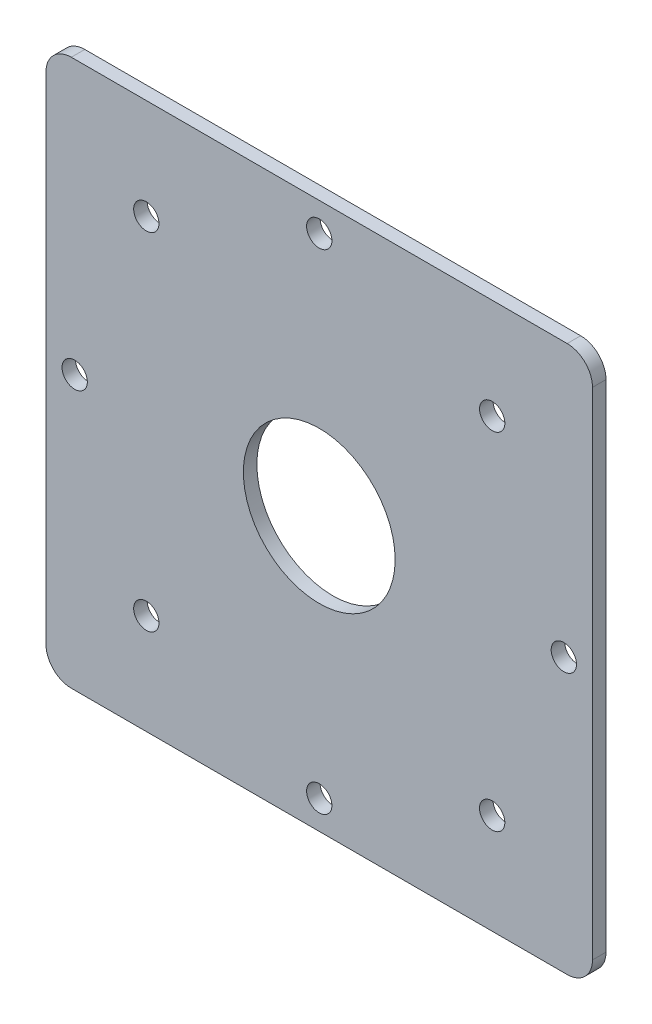
ISO-10303-21;
HEADER;
FILE_DESCRIPTION(('STEP AP214'),'2;1');
FILE_NAME('part.step','',(''),(''),'','','');
FILE_SCHEMA(('AUTOMOTIVE_DESIGN { 1 0 10303 214 1 1 1 1 }'));
ENDSEC;
DATA;
#1=APPLICATION_CONTEXT('core data for automotive mechanical design processes');
#2=APPLICATION_PROTOCOL_DEFINITION('international standard','automotive_design',2000,#1);
#3=PRODUCT_CONTEXT('',#1,'mechanical');
#4=PRODUCT('Part','Part','',(#3));
#5=PRODUCT_RELATED_PRODUCT_CATEGORY('part','',(#4));
#6=PRODUCT_DEFINITION_FORMATION('','',#4);
#7=PRODUCT_DEFINITION_CONTEXT('part definition',#1,'design');
#8=PRODUCT_DEFINITION('design','',#6,#7);
#9=PRODUCT_DEFINITION_SHAPE('','',#8);
#10=(LENGTH_UNIT() NAMED_UNIT(*) SI_UNIT(.MILLI.,.METRE.));
#11=(NAMED_UNIT(*) PLANE_ANGLE_UNIT() SI_UNIT($,.RADIAN.));
#12=(NAMED_UNIT(*) SI_UNIT($,.STERADIAN.) SOLID_ANGLE_UNIT());
#13=UNCERTAINTY_MEASURE_WITH_UNIT(LENGTH_MEASURE(1.E-05),#10,'distance_accuracy_value','');
#14=(GEOMETRIC_REPRESENTATION_CONTEXT(3) GLOBAL_UNCERTAINTY_ASSIGNED_CONTEXT((#13)) GLOBAL_UNIT_ASSIGNED_CONTEXT((#10,
#11,#12)) REPRESENTATION_CONTEXT('',''));
#15=CARTESIAN_POINT('',(0.,0.,0.));
#16=DIRECTION('',(0.,0.,1.));
#17=DIRECTION('',(1.,0.,0.));
#18=AXIS2_PLACEMENT_3D('',#15,#16,#17);
#19=CARTESIAN_POINT('',(162.,-162.,8.));
#20=DIRECTION('',(-1.,0.,0.));
#21=DIRECTION('',(0.,0.,1.));
#22=AXIS2_PLACEMENT_3D('',#19,#20,#21);
#23=PLANE('',#22);
#24=DIRECTION('',(0.,1.,0.));
#25=VECTOR('',#24,1.);
#26=CARTESIAN_POINT('',(162.,-162.,0.));
#27=LINE('',#26,#25);
#28=CARTESIAN_POINT('',(162.,-147.,0.));
#29=VERTEX_POINT('',#28);
#30=CARTESIAN_POINT('',(162.,147.,0.));
#31=VERTEX_POINT('',#30);
#32=EDGE_CURVE('E128',#29,#31,#27,.T.);
#33=ORIENTED_EDGE('',*,*,#32,.T.);
#34=DIRECTION('',(0.,0.,-1.));
#35=VECTOR('',#34,1.);
#36=CARTESIAN_POINT('',(162.,147.,8.));
#37=LINE('',#36,#35);
#38=CARTESIAN_POINT('',(162.,147.,8.));
#39=VERTEX_POINT('',#38);
#40=EDGE_CURVE('E106',#31,#39,#37,.F.);
#41=ORIENTED_EDGE('',*,*,#40,.T.);
#42=DIRECTION('',(0.,1.,0.));
#43=VECTOR('',#42,1.);
#44=CARTESIAN_POINT('',(162.,-162.,8.));
#45=LINE('',#44,#43);
#46=CARTESIAN_POINT('',(162.,-147.,8.));
#47=VERTEX_POINT('',#46);
#48=EDGE_CURVE('E138',#47,#39,#45,.T.);
#49=ORIENTED_EDGE('',*,*,#48,.F.);
#50=DIRECTION('',(0.,0.,-1.));
#51=VECTOR('',#50,1.);
#52=CARTESIAN_POINT('',(162.,-147.,8.));
#53=LINE('',#52,#51);
#54=EDGE_CURVE('E111',#47,#29,#53,.T.);
#55=ORIENTED_EDGE('',*,*,#54,.T.);
#56=EDGE_LOOP('',(#33,#41,#49,#55));
#57=FACE_BOUND('',#56,.T.);
#58=ADVANCED_FACE('F35',(#57),#23,.F.);
#59=CARTESIAN_POINT('',(-162.,162.,8.));
#60=DIRECTION('',(0.,-1.,0.));
#61=DIRECTION('',(0.,0.,-1.));
#62=AXIS2_PLACEMENT_3D('',#59,#60,#61);
#63=PLANE('',#62);
#64=DIRECTION('',(-1.,0.,0.));
#65=VECTOR('',#64,1.);
#66=CARTESIAN_POINT('',(-162.,162.,8.));
#67=LINE('',#66,#65);
#68=CARTESIAN_POINT('',(147.,162.,8.));
#69=VERTEX_POINT('',#68);
#70=CARTESIAN_POINT('',(-147.,162.,8.));
#71=VERTEX_POINT('',#70);
#72=EDGE_CURVE('E121',#69,#71,#67,.T.);
#73=ORIENTED_EDGE('',*,*,#72,.F.);
#74=DIRECTION('',(0.,0.,-1.));
#75=VECTOR('',#74,1.);
#76=CARTESIAN_POINT('',(147.,162.,8.));
#77=LINE('',#76,#75);
#78=CARTESIAN_POINT('',(147.,162.,0.));
#79=VERTEX_POINT('',#78);
#80=EDGE_CURVE('E105',#69,#79,#77,.T.);
#81=ORIENTED_EDGE('',*,*,#80,.T.);
#82=DIRECTION('',(-1.,0.,0.));
#83=VECTOR('',#82,1.);
#84=CARTESIAN_POINT('',(-162.,162.,0.));
#85=LINE('',#84,#83);
#86=CARTESIAN_POINT('',(-147.,162.,0.));
#87=VERTEX_POINT('',#86);
#88=EDGE_CURVE('E118',#79,#87,#85,.T.);
#89=ORIENTED_EDGE('',*,*,#88,.T.);
#90=DIRECTION('',(0.,0.,-1.));
#91=VECTOR('',#90,1.);
#92=CARTESIAN_POINT('',(-147.,162.,8.));
#93=LINE('',#92,#91);
#94=EDGE_CURVE('E123',#87,#71,#93,.F.);
#95=ORIENTED_EDGE('',*,*,#94,.T.);
#96=EDGE_LOOP('',(#73,#81,#89,#95));
#97=FACE_BOUND('',#96,.T.);
#98=ADVANCED_FACE('F117',(#97),#63,.F.);
#99=CARTESIAN_POINT('',(-162.,-162.,8.));
#100=DIRECTION('',(1.,0.,0.));
#101=DIRECTION('',(0.,0.,-1.));
#102=AXIS2_PLACEMENT_3D('',#99,#100,#101);
#103=PLANE('',#102);
#104=DIRECTION('',(0.,-1.,0.));
#105=VECTOR('',#104,1.);
#106=CARTESIAN_POINT('',(-162.,-162.,8.));
#107=LINE('',#106,#105);
#108=CARTESIAN_POINT('',(-162.,147.,8.));
#109=VERTEX_POINT('',#108);
#110=CARTESIAN_POINT('',(-162.,-147.,8.));
#111=VERTEX_POINT('',#110);
#112=EDGE_CURVE('E169',#109,#111,#107,.T.);
#113=ORIENTED_EDGE('',*,*,#112,.F.);
#114=DIRECTION('',(0.,0.,-1.));
#115=VECTOR('',#114,1.);
#116=CARTESIAN_POINT('',(-162.,147.,8.));
#117=LINE('',#116,#115);
#118=CARTESIAN_POINT('',(-162.,147.,0.));
#119=VERTEX_POINT('',#118);
#120=EDGE_CURVE('E162',#109,#119,#117,.T.);
#121=ORIENTED_EDGE('',*,*,#120,.T.);
#122=DIRECTION('',(0.,-1.,0.));
#123=VECTOR('',#122,1.);
#124=CARTESIAN_POINT('',(-162.,-162.,0.));
#125=LINE('',#124,#123);
#126=CARTESIAN_POINT('',(-162.,-147.,0.));
#127=VERTEX_POINT('',#126);
#128=EDGE_CURVE('E127',#119,#127,#125,.T.);
#129=ORIENTED_EDGE('',*,*,#128,.T.);
#130=DIRECTION('',(0.,0.,-1.));
#131=VECTOR('',#130,1.);
#132=CARTESIAN_POINT('',(-162.,-147.,8.));
#133=LINE('',#132,#131);
#134=EDGE_CURVE('E160',#127,#111,#133,.F.);
#135=ORIENTED_EDGE('',*,*,#134,.T.);
#136=EDGE_LOOP('',(#113,#121,#129,#135));
#137=FACE_BOUND('',#136,.T.);
#138=ADVANCED_FACE('F167',(#137),#103,.F.);
#139=CARTESIAN_POINT('',(-162.,-162.,8.));
#140=DIRECTION('',(0.,1.,0.));
#141=DIRECTION('',(0.,0.,1.));
#142=AXIS2_PLACEMENT_3D('',#139,#140,#141);
#143=PLANE('',#142);
#144=DIRECTION('',(1.,0.,0.));
#145=VECTOR('',#144,1.);
#146=CARTESIAN_POINT('',(-162.,-162.,8.));
#147=LINE('',#146,#145);
#148=CARTESIAN_POINT('',(-147.,-162.,8.));
#149=VERTEX_POINT('',#148);
#150=CARTESIAN_POINT('',(147.,-162.,8.));
#151=VERTEX_POINT('',#150);
#152=EDGE_CURVE('E144',#149,#151,#147,.T.);
#153=ORIENTED_EDGE('',*,*,#152,.F.);
#154=DIRECTION('',(0.,0.,-1.));
#155=VECTOR('',#154,1.);
#156=CARTESIAN_POINT('',(-147.,-162.,8.));
#157=LINE('',#156,#155);
#158=CARTESIAN_POINT('',(-147.,-162.,0.));
#159=VERTEX_POINT('',#158);
#160=EDGE_CURVE('E11',#149,#159,#157,.T.);
#161=ORIENTED_EDGE('',*,*,#160,.T.);
#162=DIRECTION('',(1.,0.,0.));
#163=VECTOR('',#162,1.);
#164=CARTESIAN_POINT('',(-162.,-162.,0.));
#165=LINE('',#164,#163);
#166=CARTESIAN_POINT('',(147.,-162.,0.));
#167=VERTEX_POINT('',#166);
#168=EDGE_CURVE('E131',#159,#167,#165,.T.);
#169=ORIENTED_EDGE('',*,*,#168,.T.);
#170=DIRECTION('',(0.,0.,-1.));
#171=VECTOR('',#170,1.);
#172=CARTESIAN_POINT('',(147.,-162.,8.));
#173=LINE('',#172,#171);
#174=EDGE_CURVE('E43',#167,#151,#173,.F.);
#175=ORIENTED_EDGE('',*,*,#174,.T.);
#176=EDGE_LOOP('',(#153,#161,#169,#175));
#177=FACE_BOUND('',#176,.T.);
#178=ADVANCED_FACE('F176',(#177),#143,.F.);
#179=CARTESIAN_POINT('',(0.,0.,8.));
#180=DIRECTION('',(0.,0.,-1.));
#181=DIRECTION('',(-1.,0.,0.));
#182=AXIS2_PLACEMENT_3D('',#179,#180,#181);
#183=PLANE('',#182);
#184=CARTESIAN_POINT('',(-145.,-5.06264794132254E-13,8.));
#185=DIRECTION('',(0.,0.,1.));
#186=DIRECTION('',(0.,1.,0.));
#187=AXIS2_PLACEMENT_3D('',#184,#185,#186);
#188=CIRCLE('',#187,7.5);
#189=CARTESIAN_POINT('',(-145.,7.4999999999995,8.));
#190=VERTEX_POINT('',#189);
#191=EDGE_CURVE('E215',#190,#190,#188,.T.);
#192=ORIENTED_EDGE('',*,*,#191,.F.);
#193=EDGE_LOOP('',(#192));
#194=FACE_BOUND('',#193,.T.);
#195=CARTESIAN_POINT('',(-102.530483272049,-102.53048327205,8.));
#196=DIRECTION('',(0.,0.,1.));
#197=DIRECTION('',(-0.707106781186551,0.707106781186544,0.));
#198=AXIS2_PLACEMENT_3D('',#195,#196,#197);
#199=CIRCLE('',#198,7.5);
#200=CARTESIAN_POINT('',(-107.833784130948,-97.2271824131508,8.));
#201=VERTEX_POINT('',#200);
#202=EDGE_CURVE('E209',#201,#201,#199,.T.);
#203=ORIENTED_EDGE('',*,*,#202,.F.);
#204=EDGE_LOOP('',(#203));
#205=FACE_BOUND('',#204,.T.);
#206=CARTESIAN_POINT('',(0.,-145.,8.));
#207=DIRECTION('',(0.,0.,1.));
#208=DIRECTION('',(-1.,0.,0.));
#209=AXIS2_PLACEMENT_3D('',#206,#207,#208);
#210=CIRCLE('',#209,7.5);
#211=CARTESIAN_POINT('',(-7.5,-145.,8.));
#212=VERTEX_POINT('',#211);
#213=EDGE_CURVE('E203',#212,#212,#210,.T.);
#214=ORIENTED_EDGE('',*,*,#213,.F.);
#215=EDGE_LOOP('',(#214));
#216=FACE_BOUND('',#215,.T.);
#217=CARTESIAN_POINT('',(102.53048327205,-102.530483272048,8.));
#218=DIRECTION('',(0.,0.,1.));
#219=DIRECTION('',(-0.707106781186541,-0.707106781186554,0.));
#220=AXIS2_PLACEMENT_3D('',#217,#218,#219);
#221=CIRCLE('',#220,7.5);
#222=CARTESIAN_POINT('',(97.2271824131512,-107.833784130948,8.));
#223=VERTEX_POINT('',#222);
#224=EDGE_CURVE('E196',#223,#223,#221,.T.);
#225=ORIENTED_EDGE('',*,*,#224,.F.);
#226=EDGE_LOOP('',(#225));
#227=FACE_BOUND('',#226,.T.);
#228=CARTESIAN_POINT('',(145.,1.51879438239676E-12,8.));
#229=DIRECTION('',(0.,0.,1.));
#230=DIRECTION('',(0.,-1.,0.));
#231=AXIS2_PLACEMENT_3D('',#228,#229,#230);
#232=CIRCLE('',#231,7.5);
#233=CARTESIAN_POINT('',(145.,-7.49999999999848,8.));
#234=VERTEX_POINT('',#233);
#235=EDGE_CURVE('E226',#234,#234,#232,.T.);
#236=ORIENTED_EDGE('',*,*,#235,.F.);
#237=EDGE_LOOP('',(#236));
#238=FACE_BOUND('',#237,.T.);
#239=CARTESIAN_POINT('',(102.530483272048,102.530483272051,8.));
#240=DIRECTION('',(0.,0.,1.));
#241=DIRECTION('',(0.707106781186556,-0.707106781186539,0.));
#242=AXIS2_PLACEMENT_3D('',#239,#240,#241);
#243=CIRCLE('',#242,7.5);
#244=CARTESIAN_POINT('',(107.833784130947,97.2271824131516,8.));
#245=VERTEX_POINT('',#244);
#246=EDGE_CURVE('E220',#245,#245,#243,.T.);
#247=ORIENTED_EDGE('',*,*,#246,.F.);
#248=EDGE_LOOP('',(#247));
#249=FACE_BOUND('',#248,.T.);
#250=CARTESIAN_POINT('',(-102.53048327205,102.530483272049,8.));
#251=DIRECTION('',(0.,0.,1.));
#252=DIRECTION('',(0.707106781186546,0.707106781186549,0.));
#253=AXIS2_PLACEMENT_3D('',#250,#251,#252);
#254=CIRCLE('',#253,7.5);
#255=CARTESIAN_POINT('',(-97.2271824131505,107.833784130948,8.));
#256=VERTEX_POINT('',#255);
#257=EDGE_CURVE('E190',#256,#256,#254,.T.);
#258=ORIENTED_EDGE('',*,*,#257,.F.);
#259=EDGE_LOOP('',(#258));
#260=FACE_BOUND('',#259,.T.);
#261=CARTESIAN_POINT('',(0.,0.,8.));
#262=DIRECTION('',(0.,0.,1.));
#263=DIRECTION('',(1.,0.,0.));
#264=AXIS2_PLACEMENT_3D('',#261,#262,#263);
#265=CIRCLE('',#264,45.);
#266=CARTESIAN_POINT('',(45.,0.,8.));
#267=VERTEX_POINT('',#266);
#268=EDGE_CURVE('E143',#267,#267,#265,.T.);
#269=ORIENTED_EDGE('',*,*,#268,.F.);
#270=EDGE_LOOP('',(#269));
#271=FACE_BOUND('',#270,.T.);
#272=CARTESIAN_POINT('',(0.,145.,8.));
#273=DIRECTION('',(0.,0.,1.));
#274=DIRECTION('',(1.,0.,0.));
#275=AXIS2_PLACEMENT_3D('',#272,#273,#274);
#276=CIRCLE('',#275,7.5);
#277=CARTESIAN_POINT('',(7.5,145.,8.));
#278=VERTEX_POINT('',#277);
#279=EDGE_CURVE('E142',#278,#278,#276,.T.);
#280=ORIENTED_EDGE('',*,*,#279,.F.);
#281=EDGE_LOOP('',(#280));
#282=FACE_BOUND('',#281,.T.);
#283=ORIENTED_EDGE('',*,*,#48,.T.);
#284=CARTESIAN_POINT('',(147.,147.,8.));
#285=DIRECTION('',(0.,0.,-1.));
#286=DIRECTION('',(-1.,0.,0.));
#287=AXIS2_PLACEMENT_3D('',#284,#285,#286);
#288=CIRCLE('',#287,15.);
#289=EDGE_CURVE('E158',#39,#69,#288,.F.);
#290=ORIENTED_EDGE('',*,*,#289,.T.);
#291=ORIENTED_EDGE('',*,*,#72,.T.);
#292=CARTESIAN_POINT('',(-147.,147.,8.));
#293=DIRECTION('',(0.,0.,-1.));
#294=DIRECTION('',(-1.,0.,0.));
#295=AXIS2_PLACEMENT_3D('',#292,#293,#294);
#296=CIRCLE('',#295,15.);
#297=EDGE_CURVE('E156',#71,#109,#296,.F.);
#298=ORIENTED_EDGE('',*,*,#297,.T.);
#299=ORIENTED_EDGE('',*,*,#112,.T.);
#300=CARTESIAN_POINT('',(-147.,-147.,8.));
#301=DIRECTION('',(0.,0.,-1.));
#302=DIRECTION('',(-1.,0.,0.));
#303=AXIS2_PLACEMENT_3D('',#300,#301,#302);
#304=CIRCLE('',#303,15.);
#305=EDGE_CURVE('E56',#111,#149,#304,.F.);
#306=ORIENTED_EDGE('',*,*,#305,.T.);
#307=ORIENTED_EDGE('',*,*,#152,.T.);
#308=CARTESIAN_POINT('',(147.,-147.,8.));
#309=DIRECTION('',(0.,0.,-1.));
#310=DIRECTION('',(-1.,0.,0.));
#311=AXIS2_PLACEMENT_3D('',#308,#309,#310);
#312=CIRCLE('',#311,15.);
#313=EDGE_CURVE('E153',#151,#47,#312,.F.);
#314=ORIENTED_EDGE('',*,*,#313,.T.);
#315=EDGE_LOOP('',(#283,#290,#291,#298,#299,#306,#307,#314));
#316=FACE_BOUND('',#315,.T.);
#317=ADVANCED_FACE('F242',(#194,#205,#216,#227,#238,#249,#260,#271,#282,#316),#183,.F.);
#318=CARTESIAN_POINT('',(0.,0.,0.));
#319=DIRECTION('',(0.,0.,-1.));
#320=DIRECTION('',(-1.,0.,0.));
#321=AXIS2_PLACEMENT_3D('',#318,#319,#320);
#322=PLANE('',#321);
#323=CARTESIAN_POINT('',(-145.,-5.06264794132254E-13,0.));
#324=DIRECTION('',(0.,0.,1.));
#325=DIRECTION('',(0.,1.,0.));
#326=AXIS2_PLACEMENT_3D('',#323,#324,#325);
#327=CIRCLE('',#326,7.5);
#328=CARTESIAN_POINT('',(-145.,7.4999999999995,0.));
#329=VERTEX_POINT('',#328);
#330=EDGE_CURVE('E193',#329,#329,#327,.T.);
#331=ORIENTED_EDGE('',*,*,#330,.T.);
#332=EDGE_LOOP('',(#331));
#333=FACE_BOUND('',#332,.T.);
#334=CARTESIAN_POINT('',(-102.530483272049,-102.53048327205,0.));
#335=DIRECTION('',(0.,0.,1.));
#336=DIRECTION('',(-0.707106781186551,0.707106781186544,0.));
#337=AXIS2_PLACEMENT_3D('',#334,#335,#336);
#338=CIRCLE('',#337,7.5);
#339=CARTESIAN_POINT('',(-107.833784130948,-97.2271824131508,0.));
#340=VERTEX_POINT('',#339);
#341=EDGE_CURVE('E212',#340,#340,#338,.T.);
#342=ORIENTED_EDGE('',*,*,#341,.T.);
#343=EDGE_LOOP('',(#342));
#344=FACE_BOUND('',#343,.T.);
#345=CARTESIAN_POINT('',(0.,-145.,0.));
#346=DIRECTION('',(0.,0.,1.));
#347=DIRECTION('',(-1.,0.,0.));
#348=AXIS2_PLACEMENT_3D('',#345,#346,#347);
#349=CIRCLE('',#348,7.5);
#350=CARTESIAN_POINT('',(-7.5,-145.,0.));
#351=VERTEX_POINT('',#350);
#352=EDGE_CURVE('E206',#351,#351,#349,.T.);
#353=ORIENTED_EDGE('',*,*,#352,.T.);
#354=EDGE_LOOP('',(#353));
#355=FACE_BOUND('',#354,.T.);
#356=CARTESIAN_POINT('',(102.53048327205,-102.530483272048,0.));
#357=DIRECTION('',(0.,0.,1.));
#358=DIRECTION('',(-0.707106781186541,-0.707106781186554,0.));
#359=AXIS2_PLACEMENT_3D('',#356,#357,#358);
#360=CIRCLE('',#359,7.5);
#361=CARTESIAN_POINT('',(97.2271824131512,-107.833784130948,0.));
#362=VERTEX_POINT('',#361);
#363=EDGE_CURVE('E199',#362,#362,#360,.T.);
#364=ORIENTED_EDGE('',*,*,#363,.T.);
#365=EDGE_LOOP('',(#364));
#366=FACE_BOUND('',#365,.T.);
#367=CARTESIAN_POINT('',(145.,1.51879438239676E-12,0.));
#368=DIRECTION('',(0.,0.,1.));
#369=DIRECTION('',(0.,-1.,0.));
#370=AXIS2_PLACEMENT_3D('',#367,#368,#369);
#371=CIRCLE('',#370,7.5);
#372=CARTESIAN_POINT('',(145.,-7.49999999999848,0.));
#373=VERTEX_POINT('',#372);
#374=EDGE_CURVE('E200',#373,#373,#371,.T.);
#375=ORIENTED_EDGE('',*,*,#374,.T.);
#376=EDGE_LOOP('',(#375));
#377=FACE_BOUND('',#376,.T.);
#378=CARTESIAN_POINT('',(102.530483272048,102.530483272051,0.));
#379=DIRECTION('',(0.,0.,1.));
#380=DIRECTION('',(0.707106781186556,-0.707106781186539,0.));
#381=AXIS2_PLACEMENT_3D('',#378,#379,#380);
#382=CIRCLE('',#381,7.5);
#383=CARTESIAN_POINT('',(107.833784130947,97.2271824131516,0.));
#384=VERTEX_POINT('',#383);
#385=EDGE_CURVE('E223',#384,#384,#382,.T.);
#386=ORIENTED_EDGE('',*,*,#385,.T.);
#387=EDGE_LOOP('',(#386));
#388=FACE_BOUND('',#387,.T.);
#389=CARTESIAN_POINT('',(-102.53048327205,102.530483272049,0.));
#390=DIRECTION('',(0.,0.,1.));
#391=DIRECTION('',(0.707106781186546,0.707106781186549,0.));
#392=AXIS2_PLACEMENT_3D('',#389,#390,#391);
#393=CIRCLE('',#392,7.5);
#394=CARTESIAN_POINT('',(-97.2271824131505,107.833784130948,0.));
#395=VERTEX_POINT('',#394);
#396=EDGE_CURVE('E189',#395,#395,#393,.T.);
#397=ORIENTED_EDGE('',*,*,#396,.T.);
#398=EDGE_LOOP('',(#397));
#399=FACE_BOUND('',#398,.T.);
#400=CARTESIAN_POINT('',(0.,0.,0.));
#401=DIRECTION('',(0.,0.,-1.));
#402=DIRECTION('',(-1.,0.,0.));
#403=AXIS2_PLACEMENT_3D('',#400,#401,#402);
#404=CIRCLE('',#403,45.);
#405=CARTESIAN_POINT('',(-45.,0.,0.));
#406=VERTEX_POINT('',#405);
#407=EDGE_CURVE('E139',#406,#406,#404,.T.);
#408=ORIENTED_EDGE('',*,*,#407,.F.);
#409=EDGE_LOOP('',(#408));
#410=FACE_BOUND('',#409,.T.);
#411=CARTESIAN_POINT('',(0.,145.,0.));
#412=DIRECTION('',(0.,0.,1.));
#413=DIRECTION('',(1.,0.,0.));
#414=AXIS2_PLACEMENT_3D('',#411,#412,#413);
#415=CIRCLE('',#414,7.5);
#416=CARTESIAN_POINT('',(7.5,145.,0.));
#417=VERTEX_POINT('',#416);
#418=EDGE_CURVE('E133',#417,#417,#415,.T.);
#419=ORIENTED_EDGE('',*,*,#418,.T.);
#420=EDGE_LOOP('',(#419));
#421=FACE_BOUND('',#420,.T.);
#422=ORIENTED_EDGE('',*,*,#88,.F.);
#423=CARTESIAN_POINT('',(147.,147.,0.));
#424=DIRECTION('',(0.,0.,-1.));
#425=DIRECTION('',(-1.,0.,0.));
#426=AXIS2_PLACEMENT_3D('',#423,#424,#425);
#427=CIRCLE('',#426,15.);
#428=EDGE_CURVE('E101',#79,#31,#427,.T.);
#429=ORIENTED_EDGE('',*,*,#428,.T.);
#430=ORIENTED_EDGE('',*,*,#32,.F.);
#431=CARTESIAN_POINT('',(147.,-147.,0.));
#432=DIRECTION('',(0.,0.,-1.));
#433=DIRECTION('',(-1.,0.,0.));
#434=AXIS2_PLACEMENT_3D('',#431,#432,#433);
#435=CIRCLE('',#434,15.);
#436=EDGE_CURVE('E122',#29,#167,#435,.T.);
#437=ORIENTED_EDGE('',*,*,#436,.T.);
#438=ORIENTED_EDGE('',*,*,#168,.F.);
#439=CARTESIAN_POINT('',(-147.,-147.,0.));
#440=DIRECTION('',(0.,0.,-1.));
#441=DIRECTION('',(-1.,0.,0.));
#442=AXIS2_PLACEMENT_3D('',#439,#440,#441);
#443=CIRCLE('',#442,15.);
#444=EDGE_CURVE('E147',#159,#127,#443,.T.);
#445=ORIENTED_EDGE('',*,*,#444,.T.);
#446=ORIENTED_EDGE('',*,*,#128,.F.);
#447=CARTESIAN_POINT('',(-147.,147.,0.));
#448=DIRECTION('',(0.,0.,-1.));
#449=DIRECTION('',(-1.,0.,0.));
#450=AXIS2_PLACEMENT_3D('',#447,#448,#449);
#451=CIRCLE('',#450,15.);
#452=EDGE_CURVE('E112',#119,#87,#451,.T.);
#453=ORIENTED_EDGE('',*,*,#452,.T.);
#454=EDGE_LOOP('',(#422,#429,#430,#437,#438,#445,#446,#453));
#455=FACE_BOUND('',#454,.T.);
#456=ADVANCED_FACE('F125',(#333,#344,#355,#366,#377,#388,#399,#410,#421,#455),#322,.T.);
#457=CARTESIAN_POINT('',(0.,145.,0.));
#458=DIRECTION('',(0.,0.,1.));
#459=DIRECTION('',(1.,0.,0.));
#460=AXIS2_PLACEMENT_3D('',#457,#458,#459);
#461=CYLINDRICAL_SURFACE('',#460,7.5);
#462=ORIENTED_EDGE('',*,*,#418,.F.);
#463=EDGE_LOOP('',(#462));
#464=FACE_BOUND('',#463,.T.);
#465=ORIENTED_EDGE('',*,*,#279,.T.);
#466=EDGE_LOOP('',(#465));
#467=FACE_BOUND('',#466,.T.);
#468=ADVANCED_FACE('F361',(#464,#467),#461,.F.);
#469=CARTESIAN_POINT('',(0.,0.,-2.));
#470=DIRECTION('',(0.,0.,1.));
#471=DIRECTION('',(1.,0.,0.));
#472=AXIS2_PLACEMENT_3D('',#469,#470,#471);
#473=CYLINDRICAL_SURFACE('',#472,45.);
#474=ORIENTED_EDGE('',*,*,#407,.T.);
#475=EDGE_LOOP('',(#474));
#476=FACE_BOUND('',#475,.T.);
#477=ORIENTED_EDGE('',*,*,#268,.T.);
#478=EDGE_LOOP('',(#477));
#479=FACE_BOUND('',#478,.T.);
#480=ADVANCED_FACE('F352',(#476,#479),#473,.F.);
#481=CARTESIAN_POINT('',(-102.53048327205,102.530483272049,0.));
#482=DIRECTION('',(0.,0.,1.));
#483=DIRECTION('',(1.,0.,0.));
#484=AXIS2_PLACEMENT_3D('',#481,#482,#483);
#485=CYLINDRICAL_SURFACE('',#484,7.5);
#486=ORIENTED_EDGE('',*,*,#396,.F.);
#487=EDGE_LOOP('',(#486));
#488=FACE_BOUND('',#487,.T.);
#489=ORIENTED_EDGE('',*,*,#257,.T.);
#490=EDGE_LOOP('',(#489));
#491=FACE_BOUND('',#490,.T.);
#492=ADVANCED_FACE('F343',(#488,#491),#485,.F.);
#493=CARTESIAN_POINT('',(102.530483272048,102.530483272051,0.));
#494=DIRECTION('',(0.,0.,1.));
#495=DIRECTION('',(1.,0.,0.));
#496=AXIS2_PLACEMENT_3D('',#493,#494,#495);
#497=CYLINDRICAL_SURFACE('',#496,7.5);
#498=ORIENTED_EDGE('',*,*,#385,.F.);
#499=EDGE_LOOP('',(#498));
#500=FACE_BOUND('',#499,.T.);
#501=ORIENTED_EDGE('',*,*,#246,.T.);
#502=EDGE_LOOP('',(#501));
#503=FACE_BOUND('',#502,.T.);
#504=ADVANCED_FACE('F238',(#500,#503),#497,.F.);
#505=CARTESIAN_POINT('',(145.,1.51879438239676E-12,0.));
#506=DIRECTION('',(0.,0.,1.));
#507=DIRECTION('',(1.,0.,0.));
#508=AXIS2_PLACEMENT_3D('',#505,#506,#507);
#509=CYLINDRICAL_SURFACE('',#508,7.5);
#510=ORIENTED_EDGE('',*,*,#374,.F.);
#511=EDGE_LOOP('',(#510));
#512=FACE_BOUND('',#511,.T.);
#513=ORIENTED_EDGE('',*,*,#235,.T.);
#514=EDGE_LOOP('',(#513));
#515=FACE_BOUND('',#514,.T.);
#516=ADVANCED_FACE('F234',(#512,#515),#509,.F.);
#517=CARTESIAN_POINT('',(102.53048327205,-102.530483272048,0.));
#518=DIRECTION('',(0.,0.,1.));
#519=DIRECTION('',(1.,0.,0.));
#520=AXIS2_PLACEMENT_3D('',#517,#518,#519);
#521=CYLINDRICAL_SURFACE('',#520,7.5);
#522=ORIENTED_EDGE('',*,*,#363,.F.);
#523=EDGE_LOOP('',(#522));
#524=FACE_BOUND('',#523,.T.);
#525=ORIENTED_EDGE('',*,*,#224,.T.);
#526=EDGE_LOOP('',(#525));
#527=FACE_BOUND('',#526,.T.);
#528=ADVANCED_FACE('F237',(#524,#527),#521,.F.);
#529=CARTESIAN_POINT('',(0.,-145.,0.));
#530=DIRECTION('',(0.,0.,1.));
#531=DIRECTION('',(1.,0.,0.));
#532=AXIS2_PLACEMENT_3D('',#529,#530,#531);
#533=CYLINDRICAL_SURFACE('',#532,7.5);
#534=ORIENTED_EDGE('',*,*,#352,.F.);
#535=EDGE_LOOP('',(#534));
#536=FACE_BOUND('',#535,.T.);
#537=ORIENTED_EDGE('',*,*,#213,.T.);
#538=EDGE_LOOP('',(#537));
#539=FACE_BOUND('',#538,.T.);
#540=ADVANCED_FACE('F313',(#536,#539),#533,.F.);
#541=CARTESIAN_POINT('',(-102.530483272049,-102.53048327205,0.));
#542=DIRECTION('',(0.,0.,1.));
#543=DIRECTION('',(1.,0.,0.));
#544=AXIS2_PLACEMENT_3D('',#541,#542,#543);
#545=CYLINDRICAL_SURFACE('',#544,7.5);
#546=ORIENTED_EDGE('',*,*,#341,.F.);
#547=EDGE_LOOP('',(#546));
#548=FACE_BOUND('',#547,.T.);
#549=ORIENTED_EDGE('',*,*,#202,.T.);
#550=EDGE_LOOP('',(#549));
#551=FACE_BOUND('',#550,.T.);
#552=ADVANCED_FACE('F304',(#548,#551),#545,.F.);
#553=CARTESIAN_POINT('',(-145.,-5.06264794132254E-13,0.));
#554=DIRECTION('',(0.,0.,1.));
#555=DIRECTION('',(1.,0.,0.));
#556=AXIS2_PLACEMENT_3D('',#553,#554,#555);
#557=CYLINDRICAL_SURFACE('',#556,7.5);
#558=ORIENTED_EDGE('',*,*,#330,.F.);
#559=EDGE_LOOP('',(#558));
#560=FACE_BOUND('',#559,.T.);
#561=ORIENTED_EDGE('',*,*,#191,.T.);
#562=EDGE_LOOP('',(#561));
#563=FACE_BOUND('',#562,.T.);
#564=ADVANCED_FACE('F273',(#560,#563),#557,.F.);
#565=CARTESIAN_POINT('',(147.,147.,8.));
#566=DIRECTION('',(0.,0.,-1.));
#567=DIRECTION('',(-1.,0.,0.));
#568=AXIS2_PLACEMENT_3D('',#565,#566,#567);
#569=CYLINDRICAL_SURFACE('',#568,15.);
#570=ORIENTED_EDGE('',*,*,#289,.F.);
#571=ORIENTED_EDGE('',*,*,#40,.F.);
#572=ORIENTED_EDGE('',*,*,#428,.F.);
#573=ORIENTED_EDGE('',*,*,#80,.F.);
#574=EDGE_LOOP('',(#570,#571,#572,#573));
#575=FACE_BOUND('',#574,.T.);
#576=ADVANCED_FACE('F104',(#575),#569,.T.);
#577=CARTESIAN_POINT('',(-147.,147.,8.));
#578=DIRECTION('',(0.,0.,-1.));
#579=DIRECTION('',(-1.,0.,0.));
#580=AXIS2_PLACEMENT_3D('',#577,#578,#579);
#581=CYLINDRICAL_SURFACE('',#580,15.);
#582=ORIENTED_EDGE('',*,*,#297,.F.);
#583=ORIENTED_EDGE('',*,*,#94,.F.);
#584=ORIENTED_EDGE('',*,*,#452,.F.);
#585=ORIENTED_EDGE('',*,*,#120,.F.);
#586=EDGE_LOOP('',(#582,#583,#584,#585));
#587=FACE_BOUND('',#586,.T.);
#588=ADVANCED_FACE('F262',(#587),#581,.T.);
#589=CARTESIAN_POINT('',(-147.,-147.,8.));
#590=DIRECTION('',(0.,0.,-1.));
#591=DIRECTION('',(-1.,0.,0.));
#592=AXIS2_PLACEMENT_3D('',#589,#590,#591);
#593=CYLINDRICAL_SURFACE('',#592,15.);
#594=ORIENTED_EDGE('',*,*,#305,.F.);
#595=ORIENTED_EDGE('',*,*,#134,.F.);
#596=ORIENTED_EDGE('',*,*,#444,.F.);
#597=ORIENTED_EDGE('',*,*,#160,.F.);
#598=EDGE_LOOP('',(#594,#595,#596,#597));
#599=FACE_BOUND('',#598,.T.);
#600=ADVANCED_FACE('F175',(#599),#593,.T.);
#601=CARTESIAN_POINT('',(147.,-147.,8.));
#602=DIRECTION('',(0.,0.,-1.));
#603=DIRECTION('',(-1.,0.,0.));
#604=AXIS2_PLACEMENT_3D('',#601,#602,#603);
#605=CYLINDRICAL_SURFACE('',#604,15.);
#606=ORIENTED_EDGE('',*,*,#313,.F.);
#607=ORIENTED_EDGE('',*,*,#174,.F.);
#608=ORIENTED_EDGE('',*,*,#436,.F.);
#609=ORIENTED_EDGE('',*,*,#54,.F.);
#610=EDGE_LOOP('',(#606,#607,#608,#609));
#611=FACE_BOUND('',#610,.T.);
#612=ADVANCED_FACE('F37',(#611),#605,.T.);
#613=CLOSED_SHELL('',(#58,#98,#138,#178,#317,#456,#468,#480,#492,#504,#516,#528,#540,#552,#564,
#576,#588,#600,#612));
#614=MANIFOLD_SOLID_BREP('B2',#613);
#615=ADVANCED_BREP_SHAPE_REPRESENTATION('',(#18,#614),#14);
#616=SHAPE_DEFINITION_REPRESENTATION(#9,#615);
ENDSEC;
END-ISO-10303-21;
